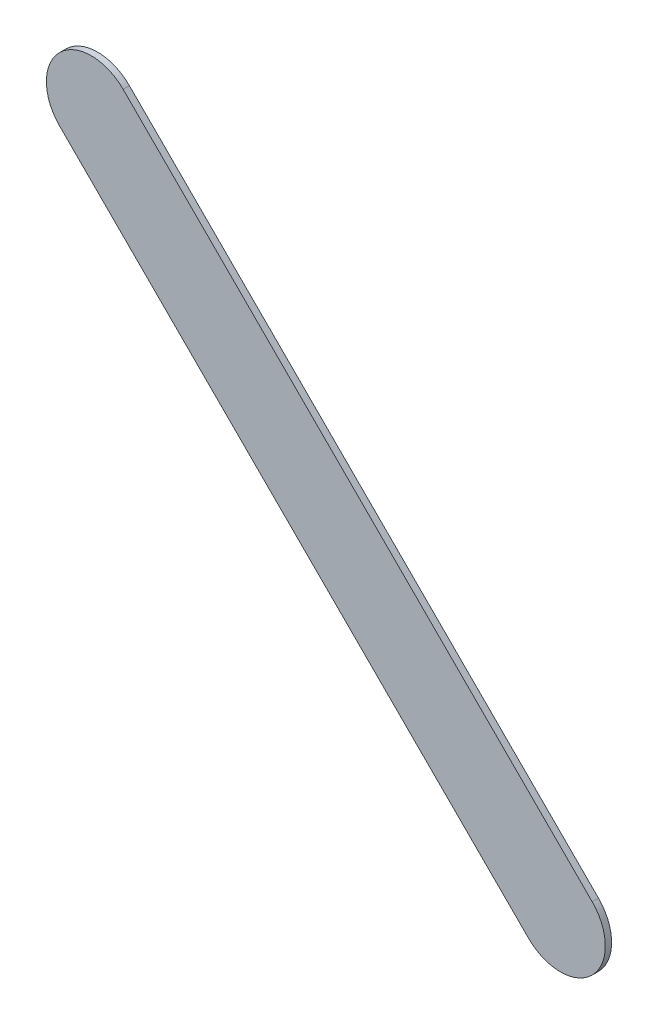
ISO-10303-21;
HEADER;
FILE_DESCRIPTION(('STEP AP214'),'2;1');
FILE_NAME('part.step','',(''),(''),'','','');
FILE_SCHEMA(('AUTOMOTIVE_DESIGN { 1 0 10303 214 1 1 1 1 }'));
ENDSEC;
DATA;
#1=APPLICATION_CONTEXT('core data for automotive mechanical design processes');
#2=APPLICATION_PROTOCOL_DEFINITION('international standard','automotive_design',2000,#1);
#3=PRODUCT_CONTEXT('',#1,'mechanical');
#4=PRODUCT('Part','Part','',(#3));
#5=PRODUCT_RELATED_PRODUCT_CATEGORY('part','',(#4));
#6=PRODUCT_DEFINITION_FORMATION('','',#4);
#7=PRODUCT_DEFINITION_CONTEXT('part definition',#1,'design');
#8=PRODUCT_DEFINITION('design','',#6,#7);
#9=PRODUCT_DEFINITION_SHAPE('','',#8);
#10=(LENGTH_UNIT() NAMED_UNIT(*) SI_UNIT(.MILLI.,.METRE.));
#11=(NAMED_UNIT(*) PLANE_ANGLE_UNIT() SI_UNIT($,.RADIAN.));
#12=(NAMED_UNIT(*) SI_UNIT($,.STERADIAN.) SOLID_ANGLE_UNIT());
#13=UNCERTAINTY_MEASURE_WITH_UNIT(LENGTH_MEASURE(1.E-05),#10,'distance_accuracy_value','');
#14=(GEOMETRIC_REPRESENTATION_CONTEXT(3) GLOBAL_UNCERTAINTY_ASSIGNED_CONTEXT((#13)) GLOBAL_UNIT_ASSIGNED_CONTEXT((#10,
#11,#12)) REPRESENTATION_CONTEXT('',''));
#15=CARTESIAN_POINT('',(0.,0.,0.));
#16=DIRECTION('',(0.,0.,1.));
#17=DIRECTION('',(1.,0.,0.));
#18=AXIS2_PLACEMENT_3D('',#15,#16,#17);
#19=CARTESIAN_POINT('',(160.053223,-56.556776,1.635));
#20=DIRECTION('',(0.,0.,1.));
#21=DIRECTION('',(1.,0.,0.));
#22=AXIS2_PLACEMENT_3D('',#19,#20,#21);
#23=PLANE('',#22);
#24=DIRECTION('',(0.707106781186548,-0.707106781186548,0.));
#25=VECTOR('',#24,1.);
#26=CARTESIAN_POINT('',(160.053223,-56.556776,1.635));
#27=LINE('',#26,#25);
#28=CARTESIAN_POINT('',(160.053223,-56.556776,1.635));
#29=VERTEX_POINT('',#28);
#30=CARTESIAN_POINT('',(162.663223,-59.166776,1.635));
#31=VERTEX_POINT('',#30);
#32=EDGE_CURVE('E82',#29,#31,#27,.T.);
#33=ORIENTED_EDGE('',*,*,#32,.T.);
#34=CARTESIAN_POINT('',(162.8399995,-58.9899995,1.635));
#35=DIRECTION('',(0.,0.,1.));
#36=DIRECTION('',(-0.707106781186548,-0.707106781186548,0.));
#37=AXIS2_PLACEMENT_3D('',#34,#35,#36);
#38=CIRCLE('',#37,0.249999723809);
#39=CARTESIAN_POINT('',(163.016776,-58.813223,1.635));
#40=VERTEX_POINT('',#39);
#41=EDGE_CURVE('E108',#31,#40,#38,.T.);
#42=ORIENTED_EDGE('',*,*,#41,.T.);
#43=DIRECTION('',(-0.707106781186548,0.707106781186548,0.));
#44=VECTOR('',#43,1.);
#45=CARTESIAN_POINT('',(163.016776,-58.813223,1.635));
#46=LINE('',#45,#44);
#47=CARTESIAN_POINT('',(160.406776,-56.203223,1.635));
#48=VERTEX_POINT('',#47);
#49=EDGE_CURVE('E74',#40,#48,#46,.T.);
#50=ORIENTED_EDGE('',*,*,#49,.T.);
#51=CARTESIAN_POINT('',(160.2299995,-56.3799995,1.635));
#52=DIRECTION('',(0.,0.,1.));
#53=DIRECTION('',(0.707106781186548,0.707106781186548,0.));
#54=AXIS2_PLACEMENT_3D('',#51,#52,#53);
#55=CIRCLE('',#54,0.249999723809);
#56=EDGE_CURVE('E11',#48,#29,#55,.T.);
#57=ORIENTED_EDGE('',*,*,#56,.T.);
#58=EDGE_LOOP('',(#33,#42,#50,#57));
#59=FACE_BOUND('',#58,.T.);
#60=ADVANCED_FACE('F17',(#59),#23,.T.);
#61=CARTESIAN_POINT('',(160.053223,-56.556776,1.6));
#62=DIRECTION('',(0.,0.,1.));
#63=DIRECTION('',(1.,0.,0.));
#64=AXIS2_PLACEMENT_3D('',#61,#62,#63);
#65=PLANE('',#64);
#66=CARTESIAN_POINT('',(160.2299995,-56.3799995,1.6));
#67=DIRECTION('',(0.,0.,1.));
#68=DIRECTION('',(0.707106781186548,0.707106781186548,0.));
#69=AXIS2_PLACEMENT_3D('',#66,#67,#68);
#70=CIRCLE('',#69,0.249999723809);
#71=CARTESIAN_POINT('',(160.406776,-56.203223,1.6));
#72=VERTEX_POINT('',#71);
#73=CARTESIAN_POINT('',(160.053223,-56.556776,1.6));
#74=VERTEX_POINT('',#73);
#75=EDGE_CURVE('E25',#72,#74,#70,.T.);
#76=ORIENTED_EDGE('',*,*,#75,.F.);
#77=DIRECTION('',(-0.707106781186548,0.707106781186548,0.));
#78=VECTOR('',#77,1.);
#79=CARTESIAN_POINT('',(163.016776,-58.813223,1.6));
#80=LINE('',#79,#78);
#81=CARTESIAN_POINT('',(163.016776,-58.813223,1.6));
#82=VERTEX_POINT('',#81);
#83=EDGE_CURVE('E111',#82,#72,#80,.T.);
#84=ORIENTED_EDGE('',*,*,#83,.F.);
#85=CARTESIAN_POINT('',(162.8399995,-58.9899995,1.6));
#86=DIRECTION('',(0.,0.,1.));
#87=DIRECTION('',(-0.707106781186548,-0.707106781186548,0.));
#88=AXIS2_PLACEMENT_3D('',#85,#86,#87);
#89=CIRCLE('',#88,0.249999723809);
#90=CARTESIAN_POINT('',(162.663223,-59.166776,1.6));
#91=VERTEX_POINT('',#90);
#92=EDGE_CURVE('E84',#91,#82,#89,.T.);
#93=ORIENTED_EDGE('',*,*,#92,.F.);
#94=DIRECTION('',(0.707106781186548,-0.707106781186548,0.));
#95=VECTOR('',#94,1.);
#96=CARTESIAN_POINT('',(160.053223,-56.556776,1.6));
#97=LINE('',#96,#95);
#98=EDGE_CURVE('E80',#74,#91,#97,.T.);
#99=ORIENTED_EDGE('',*,*,#98,.F.);
#100=EDGE_LOOP('',(#76,#84,#93,#99));
#101=FACE_BOUND('',#100,.T.);
#102=ADVANCED_FACE('F86',(#101),#65,.F.);
#103=CARTESIAN_POINT('',(160.2299995,-56.3799995,1.6));
#104=DIRECTION('',(0.,0.,-1.));
#105=DIRECTION('',(0.707106781186548,0.707106781186548,0.));
#106=AXIS2_PLACEMENT_3D('',#103,#104,#105);
#107=CYLINDRICAL_SURFACE('',#106,0.249999723809);
#108=ORIENTED_EDGE('',*,*,#75,.T.);
#109=DIRECTION('',(0.,0.,1.));
#110=VECTOR('',#109,1.);
#111=CARTESIAN_POINT('',(160.053223,-56.556776,1.6));
#112=LINE('',#111,#110);
#113=EDGE_CURVE('E68',#74,#29,#112,.T.);
#114=ORIENTED_EDGE('',*,*,#113,.T.);
#115=ORIENTED_EDGE('',*,*,#56,.F.);
#116=DIRECTION('',(0.,0.,1.));
#117=VECTOR('',#116,1.);
#118=CARTESIAN_POINT('',(160.406776,-56.203223,1.6));
#119=LINE('',#118,#117);
#120=EDGE_CURVE('E71',#72,#48,#119,.T.);
#121=ORIENTED_EDGE('',*,*,#120,.F.);
#122=EDGE_LOOP('',(#108,#114,#115,#121));
#123=FACE_BOUND('',#122,.T.);
#124=ADVANCED_FACE('F67',(#123),#107,.T.);
#125=CARTESIAN_POINT('',(163.016776,-58.813223,1.6));
#126=DIRECTION('',(-0.707106781186548,-0.707106781186548,0.));
#127=DIRECTION('',(-0.707106781186548,0.707106781186548,0.));
#128=AXIS2_PLACEMENT_3D('',#125,#126,#127);
#129=PLANE('',#128);
#130=ORIENTED_EDGE('',*,*,#83,.T.);
#131=ORIENTED_EDGE('',*,*,#120,.T.);
#132=ORIENTED_EDGE('',*,*,#49,.F.);
#133=DIRECTION('',(0.,0.,1.));
#134=VECTOR('',#133,1.);
#135=CARTESIAN_POINT('',(163.016776,-58.813223,1.6));
#136=LINE('',#135,#134);
#137=EDGE_CURVE('E102',#82,#40,#136,.T.);
#138=ORIENTED_EDGE('',*,*,#137,.F.);
#139=EDGE_LOOP('',(#130,#131,#132,#138));
#140=FACE_BOUND('',#139,.T.);
#141=ADVANCED_FACE('F118',(#140),#129,.F.);
#142=CARTESIAN_POINT('',(162.8399995,-58.9899995,1.6));
#143=DIRECTION('',(0.,0.,-1.));
#144=DIRECTION('',(-0.707106781186548,-0.707106781186548,0.));
#145=AXIS2_PLACEMENT_3D('',#142,#143,#144);
#146=CYLINDRICAL_SURFACE('',#145,0.249999723809);
#147=ORIENTED_EDGE('',*,*,#92,.T.);
#148=ORIENTED_EDGE('',*,*,#137,.T.);
#149=ORIENTED_EDGE('',*,*,#41,.F.);
#150=DIRECTION('',(0.,0.,1.));
#151=VECTOR('',#150,1.);
#152=CARTESIAN_POINT('',(162.663223,-59.166776,1.6));
#153=LINE('',#152,#151);
#154=EDGE_CURVE('E90',#91,#31,#153,.T.);
#155=ORIENTED_EDGE('',*,*,#154,.F.);
#156=EDGE_LOOP('',(#147,#148,#149,#155));
#157=FACE_BOUND('',#156,.T.);
#158=ADVANCED_FACE('F121',(#157),#146,.T.);
#159=CARTESIAN_POINT('',(160.053223,-56.556776,1.6));
#160=DIRECTION('',(0.707106781186548,0.707106781186548,0.));
#161=DIRECTION('',(0.,0.,-1.));
#162=AXIS2_PLACEMENT_3D('',#159,#160,#161);
#163=PLANE('',#162);
#164=ORIENTED_EDGE('',*,*,#98,.T.);
#165=ORIENTED_EDGE('',*,*,#154,.T.);
#166=ORIENTED_EDGE('',*,*,#32,.F.);
#167=ORIENTED_EDGE('',*,*,#113,.F.);
#168=EDGE_LOOP('',(#164,#165,#166,#167));
#169=FACE_BOUND('',#168,.T.);
#170=ADVANCED_FACE('F78',(#169),#163,.F.);
#171=CLOSED_SHELL('',(#60,#102,#124,#141,#158,#170));
#172=MANIFOLD_SOLID_BREP('B1',#171);
#173=ADVANCED_BREP_SHAPE_REPRESENTATION('',(#18,#172),#14);
#174=SHAPE_DEFINITION_REPRESENTATION(#9,#173);
ENDSEC;
END-ISO-10303-21;
